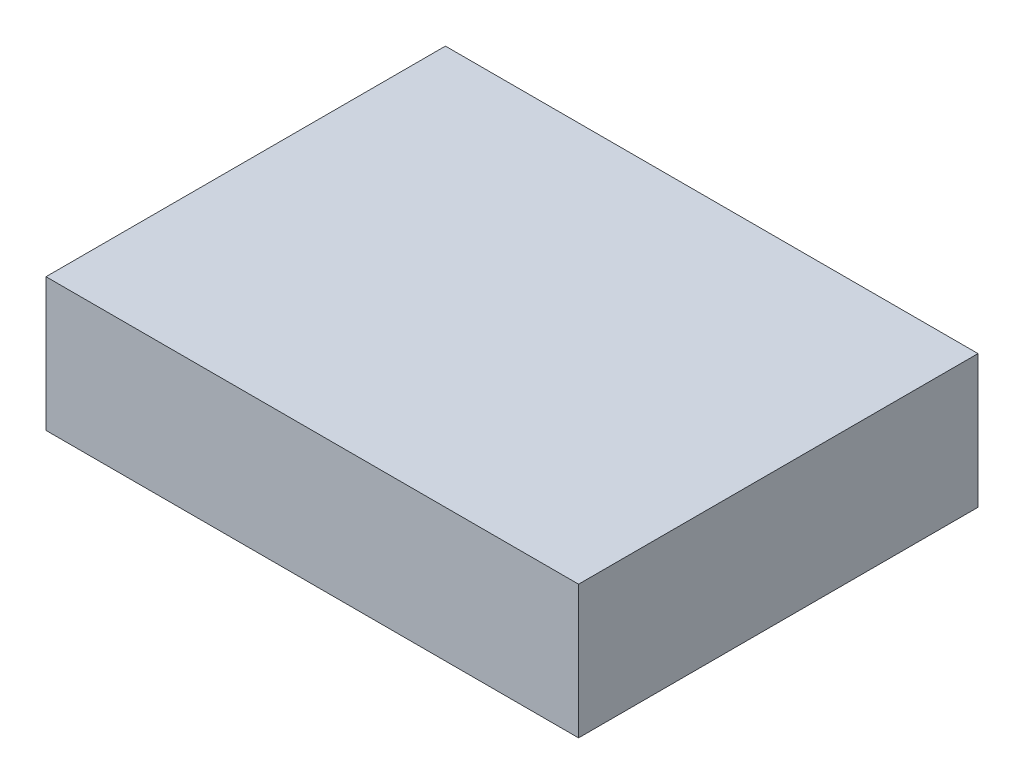
ISO-10303-21;
HEADER;
FILE_DESCRIPTION(('STEP AP214'),'2;1');
FILE_NAME('part.step','',(''),(''),'','','');
FILE_SCHEMA(('AUTOMOTIVE_DESIGN { 1 0 10303 214 1 1 1 1 }'));
ENDSEC;
DATA;
#1=APPLICATION_CONTEXT('core data for automotive mechanical design processes');
#2=APPLICATION_PROTOCOL_DEFINITION('international standard','automotive_design',2000,#1);
#3=PRODUCT_CONTEXT('',#1,'mechanical');
#4=PRODUCT('Part','Part','',(#3));
#5=PRODUCT_RELATED_PRODUCT_CATEGORY('part','',(#4));
#6=PRODUCT_DEFINITION_FORMATION('','',#4);
#7=PRODUCT_DEFINITION_CONTEXT('part definition',#1,'design');
#8=PRODUCT_DEFINITION('design','',#6,#7);
#9=PRODUCT_DEFINITION_SHAPE('','',#8);
#10=(LENGTH_UNIT() NAMED_UNIT(*) SI_UNIT(.MILLI.,.METRE.));
#11=(NAMED_UNIT(*) PLANE_ANGLE_UNIT() SI_UNIT($,.RADIAN.));
#12=(NAMED_UNIT(*) SI_UNIT($,.STERADIAN.) SOLID_ANGLE_UNIT());
#13=UNCERTAINTY_MEASURE_WITH_UNIT(LENGTH_MEASURE(1.E-05),#10,'distance_accuracy_value','');
#14=(GEOMETRIC_REPRESENTATION_CONTEXT(3) GLOBAL_UNCERTAINTY_ASSIGNED_CONTEXT((#13)) GLOBAL_UNIT_ASSIGNED_CONTEXT((#10,
#11,#12)) REPRESENTATION_CONTEXT('',''));
#15=CARTESIAN_POINT('',(0.,0.,0.));
#16=DIRECTION('',(0.,0.,1.));
#17=DIRECTION('',(1.,0.,0.));
#18=AXIS2_PLACEMENT_3D('',#15,#16,#17);
#19=CARTESIAN_POINT('',(-25.4,0.,152.4));
#20=DIRECTION('',(1.,0.,0.));
#21=DIRECTION('',(0.,1.,0.));
#22=AXIS2_PLACEMENT_3D('',#19,#20,#21);
#23=PLANE('',#22);
#24=DIRECTION('',(0.,-1.,0.));
#25=VECTOR('',#24,1.);
#26=CARTESIAN_POINT('',(-25.4,0.,0.));
#27=LINE('',#26,#25);
#28=CARTESIAN_POINT('',(-25.4,0.,0.));
#29=VERTEX_POINT('',#28);
#30=CARTESIAN_POINT('',(-25.4,-50.8,0.));
#31=VERTEX_POINT('',#30);
#32=EDGE_CURVE('E102',#29,#31,#27,.T.);
#33=ORIENTED_EDGE('',*,*,#32,.T.);
#34=DIRECTION('',(0.,0.,-1.));
#35=VECTOR('',#34,1.);
#36=CARTESIAN_POINT('',(-25.4,-50.8,152.4));
#37=LINE('',#36,#35);
#38=CARTESIAN_POINT('',(-25.4,-50.8,152.4));
#39=VERTEX_POINT('',#38);
#40=EDGE_CURVE('E11',#39,#31,#37,.T.);
#41=ORIENTED_EDGE('',*,*,#40,.F.);
#42=DIRECTION('',(0.,-1.,0.));
#43=VECTOR('',#42,1.);
#44=CARTESIAN_POINT('',(-25.4,0.,152.4));
#45=LINE('',#44,#43);
#46=CARTESIAN_POINT('',(-25.4,0.,152.4));
#47=VERTEX_POINT('',#46);
#48=EDGE_CURVE('E90',#47,#39,#45,.T.);
#49=ORIENTED_EDGE('',*,*,#48,.F.);
#50=DIRECTION('',(0.,0.,-1.));
#51=VECTOR('',#50,1.);
#52=CARTESIAN_POINT('',(-25.4,0.,152.4));
#53=LINE('',#52,#51);
#54=EDGE_CURVE('E98',#47,#29,#53,.T.);
#55=ORIENTED_EDGE('',*,*,#54,.T.);
#56=EDGE_LOOP('',(#33,#41,#49,#55));
#57=FACE_BOUND('',#56,.T.);
#58=ADVANCED_FACE('F39',(#57),#23,.F.);
#59=CARTESIAN_POINT('',(-25.4,-50.8,152.4));
#60=DIRECTION('',(0.,1.,0.));
#61=DIRECTION('',(0.,0.,1.));
#62=AXIS2_PLACEMENT_3D('',#59,#60,#61);
#63=PLANE('',#62);
#64=DIRECTION('',(1.,0.,0.));
#65=VECTOR('',#64,1.);
#66=CARTESIAN_POINT('',(-25.4,-50.8,0.));
#67=LINE('',#66,#65);
#68=CARTESIAN_POINT('',(177.8,-50.8,0.));
#69=VERTEX_POINT('',#68);
#70=EDGE_CURVE('E94',#31,#69,#67,.T.);
#71=ORIENTED_EDGE('',*,*,#70,.T.);
#72=DIRECTION('',(0.,0.,-1.));
#73=VECTOR('',#72,1.);
#74=CARTESIAN_POINT('',(177.8,-50.8,152.4));
#75=LINE('',#74,#73);
#76=CARTESIAN_POINT('',(177.8,-50.8,152.4));
#77=VERTEX_POINT('',#76);
#78=EDGE_CURVE('E47',#77,#69,#75,.T.);
#79=ORIENTED_EDGE('',*,*,#78,.F.);
#80=DIRECTION('',(1.,0.,0.));
#81=VECTOR('',#80,1.);
#82=CARTESIAN_POINT('',(-25.4,-50.8,152.4));
#83=LINE('',#82,#81);
#84=EDGE_CURVE('E85',#39,#77,#83,.T.);
#85=ORIENTED_EDGE('',*,*,#84,.F.);
#86=ORIENTED_EDGE('',*,*,#40,.T.);
#87=EDGE_LOOP('',(#71,#79,#85,#86));
#88=FACE_BOUND('',#87,.T.);
#89=ADVANCED_FACE('F93',(#88),#63,.F.);
#90=CARTESIAN_POINT('',(177.8,0.,152.4));
#91=DIRECTION('',(-1.,0.,0.));
#92=DIRECTION('',(0.,0.,1.));
#93=AXIS2_PLACEMENT_3D('',#90,#91,#92);
#94=PLANE('',#93);
#95=DIRECTION('',(0.,1.,0.));
#96=VECTOR('',#95,1.);
#97=CARTESIAN_POINT('',(177.8,0.,0.));
#98=LINE('',#97,#96);
#99=CARTESIAN_POINT('',(177.8,0.,0.));
#100=VERTEX_POINT('',#99);
#101=EDGE_CURVE('E72',#69,#100,#98,.T.);
#102=ORIENTED_EDGE('',*,*,#101,.T.);
#103=DIRECTION('',(0.,0.,-1.));
#104=VECTOR('',#103,1.);
#105=CARTESIAN_POINT('',(177.8,0.,152.4));
#106=LINE('',#105,#104);
#107=CARTESIAN_POINT('',(177.8,0.,152.4));
#108=VERTEX_POINT('',#107);
#109=EDGE_CURVE('E95',#108,#100,#106,.T.);
#110=ORIENTED_EDGE('',*,*,#109,.F.);
#111=DIRECTION('',(0.,1.,0.));
#112=VECTOR('',#111,1.);
#113=CARTESIAN_POINT('',(177.8,0.,152.4));
#114=LINE('',#113,#112);
#115=EDGE_CURVE('E88',#77,#108,#114,.T.);
#116=ORIENTED_EDGE('',*,*,#115,.F.);
#117=ORIENTED_EDGE('',*,*,#78,.T.);
#118=EDGE_LOOP('',(#102,#110,#116,#117));
#119=FACE_BOUND('',#118,.T.);
#120=ADVANCED_FACE('F96',(#119),#94,.F.);
#121=CARTESIAN_POINT('',(-25.4,0.,152.4));
#122=DIRECTION('',(0.,-1.,0.));
#123=DIRECTION('',(0.,0.,-1.));
#124=AXIS2_PLACEMENT_3D('',#121,#122,#123);
#125=PLANE('',#124);
#126=DIRECTION('',(-1.,0.,0.));
#127=VECTOR('',#126,1.);
#128=CARTESIAN_POINT('',(-25.4,0.,0.));
#129=LINE('',#128,#127);
#130=EDGE_CURVE('E78',#100,#29,#129,.T.);
#131=ORIENTED_EDGE('',*,*,#130,.T.);
#132=ORIENTED_EDGE('',*,*,#54,.F.);
#133=DIRECTION('',(-1.,0.,0.));
#134=VECTOR('',#133,1.);
#135=CARTESIAN_POINT('',(-25.4,0.,152.4));
#136=LINE('',#135,#134);
#137=EDGE_CURVE('E55',#108,#47,#136,.T.);
#138=ORIENTED_EDGE('',*,*,#137,.F.);
#139=ORIENTED_EDGE('',*,*,#109,.T.);
#140=EDGE_LOOP('',(#131,#132,#138,#139));
#141=FACE_BOUND('',#140,.T.);
#142=ADVANCED_FACE('F109',(#141),#125,.F.);
#143=CARTESIAN_POINT('',(-25.4,-50.8,152.4));
#144=DIRECTION('',(0.,0.,1.));
#145=DIRECTION('',(1.,0.,0.));
#146=AXIS2_PLACEMENT_3D('',#143,#144,#145);
#147=PLANE('',#146);
#148=ORIENTED_EDGE('',*,*,#48,.T.);
#149=ORIENTED_EDGE('',*,*,#84,.T.);
#150=ORIENTED_EDGE('',*,*,#115,.T.);
#151=ORIENTED_EDGE('',*,*,#137,.T.);
#152=EDGE_LOOP('',(#148,#149,#150,#151));
#153=FACE_BOUND('',#152,.T.);
#154=ADVANCED_FACE('F86',(#153),#147,.T.);
#155=CARTESIAN_POINT('',(-25.4,-50.8,0.));
#156=DIRECTION('',(0.,0.,1.));
#157=DIRECTION('',(1.,0.,0.));
#158=AXIS2_PLACEMENT_3D('',#155,#156,#157);
#159=PLANE('',#158);
#160=ORIENTED_EDGE('',*,*,#32,.F.);
#161=ORIENTED_EDGE('',*,*,#130,.F.);
#162=ORIENTED_EDGE('',*,*,#101,.F.);
#163=ORIENTED_EDGE('',*,*,#70,.F.);
#164=EDGE_LOOP('',(#160,#161,#162,#163));
#165=FACE_BOUND('',#164,.T.);
#166=ADVANCED_FACE('F112',(#165),#159,.F.);
#167=CLOSED_SHELL('',(#58,#89,#120,#142,#154,#166));
#168=MANIFOLD_SOLID_BREP('B2',#167);
#169=ADVANCED_BREP_SHAPE_REPRESENTATION('',(#18,#168),#14);
#170=SHAPE_DEFINITION_REPRESENTATION(#9,#169);
ENDSEC;
END-ISO-10303-21;
